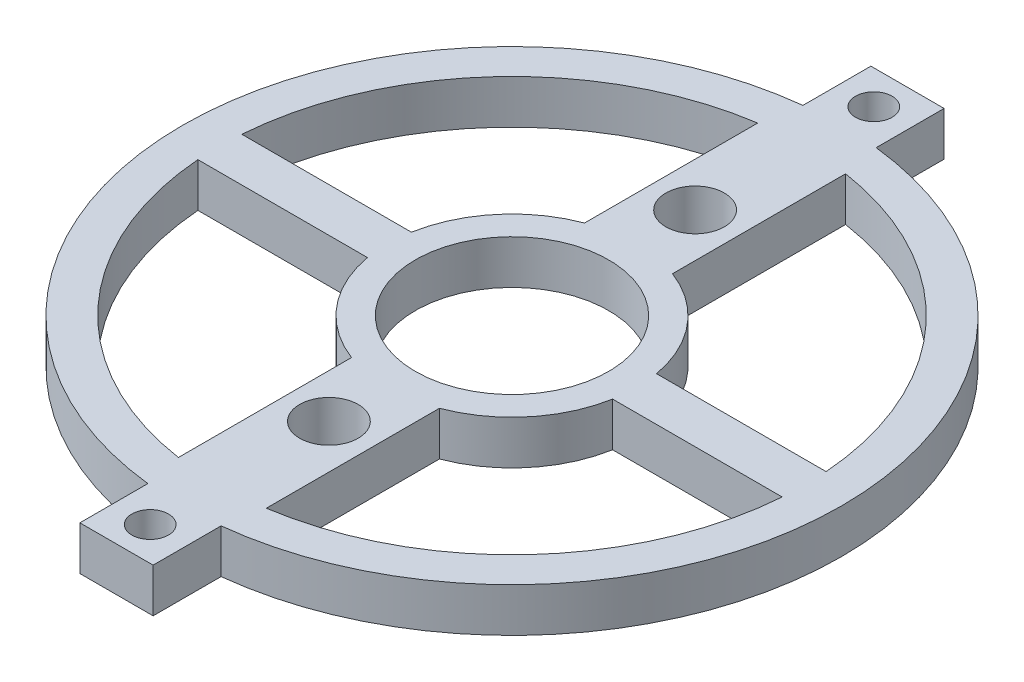
ISO-10303-21;
HEADER;
FILE_DESCRIPTION(('STEP AP214'),'2;1');
FILE_NAME('part.step','',(''),(''),'','','');
FILE_SCHEMA(('AUTOMOTIVE_DESIGN { 1 0 10303 214 1 1 1 1 }'));
ENDSEC;
DATA;
#1=APPLICATION_CONTEXT('core data for automotive mechanical design processes');
#2=APPLICATION_PROTOCOL_DEFINITION('international standard','automotive_design',2000,#1);
#3=PRODUCT_CONTEXT('',#1,'mechanical');
#4=PRODUCT('Part','Part','',(#3));
#5=PRODUCT_RELATED_PRODUCT_CATEGORY('part','',(#4));
#6=PRODUCT_DEFINITION_FORMATION('','',#4);
#7=PRODUCT_DEFINITION_CONTEXT('part definition',#1,'design');
#8=PRODUCT_DEFINITION('design','',#6,#7);
#9=PRODUCT_DEFINITION_SHAPE('','',#8);
#10=(LENGTH_UNIT() NAMED_UNIT(*) SI_UNIT(.MILLI.,.METRE.));
#11=(NAMED_UNIT(*) PLANE_ANGLE_UNIT() SI_UNIT($,.RADIAN.));
#12=(NAMED_UNIT(*) SI_UNIT($,.STERADIAN.) SOLID_ANGLE_UNIT());
#13=UNCERTAINTY_MEASURE_WITH_UNIT(LENGTH_MEASURE(1.E-05),#10,'distance_accuracy_value','');
#14=(GEOMETRIC_REPRESENTATION_CONTEXT(3) GLOBAL_UNCERTAINTY_ASSIGNED_CONTEXT((#13)) GLOBAL_UNIT_ASSIGNED_CONTEXT((#10,
#11,#12)) REPRESENTATION_CONTEXT('',''));
#15=CARTESIAN_POINT('',(0.,0.,0.));
#16=DIRECTION('',(0.,0.,1.));
#17=DIRECTION('',(1.,0.,0.));
#18=AXIS2_PLACEMENT_3D('',#15,#16,#17);
#19=CARTESIAN_POINT('',(0.,3.,0.));
#20=DIRECTION('',(0.,-1.,0.));
#21=DIRECTION('',(0.,0.,-1.));
#22=AXIS2_PLACEMENT_3D('',#19,#20,#21);
#23=CYLINDRICAL_SURFACE('',#22,20.);
#24=CARTESIAN_POINT('',(0.,0.,0.));
#25=DIRECTION('',(0.,1.,0.));
#26=DIRECTION('',(0.,0.,1.));
#27=AXIS2_PLACEMENT_3D('',#24,#25,#26);
#28=CIRCLE('',#27,20.);
#29=CARTESIAN_POINT('',(-3.,0.,-19.7737199332852));
#30=VERTEX_POINT('',#29);
#31=CARTESIAN_POINT('',(-19.9436706751791,0.,-1.5));
#32=VERTEX_POINT('',#31);
#33=EDGE_CURVE('E218',#30,#32,#28,.T.);
#34=ORIENTED_EDGE('',*,*,#33,.F.);
#35=DIRECTION('',(0.,-1.,0.));
#36=VECTOR('',#35,1.);
#37=CARTESIAN_POINT('',(-3.,3.,-19.7737199332852));
#38=LINE('',#37,#36);
#39=CARTESIAN_POINT('',(-3.,3.,-19.7737199332852));
#40=VERTEX_POINT('',#39);
#41=EDGE_CURVE('E204',#40,#30,#38,.T.);
#42=ORIENTED_EDGE('',*,*,#41,.F.);
#43=CARTESIAN_POINT('',(0.,3.,0.));
#44=DIRECTION('',(0.,1.,0.));
#45=DIRECTION('',(0.,0.,1.));
#46=AXIS2_PLACEMENT_3D('',#43,#44,#45);
#47=CIRCLE('',#46,20.);
#48=CARTESIAN_POINT('',(-19.9436706751791,3.,-1.5));
#49=VERTEX_POINT('',#48);
#50=EDGE_CURVE('E216',#40,#49,#47,.T.);
#51=ORIENTED_EDGE('',*,*,#50,.T.);
#52=DIRECTION('',(0.,-1.,0.));
#53=VECTOR('',#52,1.);
#54=CARTESIAN_POINT('',(-19.9436706751791,3.,-1.5));
#55=LINE('',#54,#53);
#56=EDGE_CURVE('E323',#49,#32,#55,.T.);
#57=ORIENTED_EDGE('',*,*,#56,.T.);
#58=EDGE_LOOP('',(#34,#42,#51,#57));
#59=FACE_BOUND('',#58,.T.);
#60=ADVANCED_FACE('F37',(#59),#23,.F.);
#61=CARTESIAN_POINT('',(-19.9436706751791,0.,1.49999999999999));
#62=VERTEX_POINT('',#61);
#63=CARTESIAN_POINT('',(-3.,0.,19.7737199332852));
#64=VERTEX_POINT('',#63);
#65=EDGE_CURVE('E241',#62,#64,#28,.T.);
#66=ORIENTED_EDGE('',*,*,#65,.F.);
#67=DIRECTION('',(0.,-1.,0.));
#68=VECTOR('',#67,1.);
#69=CARTESIAN_POINT('',(-19.9436706751791,3.,1.49999999999999));
#70=LINE('',#69,#68);
#71=CARTESIAN_POINT('',(-19.9436706751791,3.,1.5));
#72=VERTEX_POINT('',#71);
#73=EDGE_CURVE('E325',#72,#62,#70,.T.);
#74=ORIENTED_EDGE('',*,*,#73,.F.);
#75=CARTESIAN_POINT('',(-3.,3.,19.7737199332852));
#76=VERTEX_POINT('',#75);
#77=EDGE_CURVE('E227',#72,#76,#47,.T.);
#78=ORIENTED_EDGE('',*,*,#77,.T.);
#79=DIRECTION('',(0.,-1.,0.));
#80=VECTOR('',#79,1.);
#81=CARTESIAN_POINT('',(-3.,3.,19.7737199332852));
#82=LINE('',#81,#80);
#83=EDGE_CURVE('E333',#76,#64,#82,.T.);
#84=ORIENTED_EDGE('',*,*,#83,.T.);
#85=EDGE_LOOP('',(#66,#74,#78,#84));
#86=FACE_BOUND('',#85,.T.);
#87=ADVANCED_FACE('F462',(#86),#23,.F.);
#88=CARTESIAN_POINT('',(3.00000000000001,0.,19.7737199332852));
#89=VERTEX_POINT('',#88);
#90=CARTESIAN_POINT('',(19.9436706751791,0.,1.5));
#91=VERTEX_POINT('',#90);
#92=EDGE_CURVE('E232',#89,#91,#28,.T.);
#93=ORIENTED_EDGE('',*,*,#92,.F.);
#94=DIRECTION('',(0.,-1.,0.));
#95=VECTOR('',#94,1.);
#96=CARTESIAN_POINT('',(3.00000000000001,3.,19.7737199332852));
#97=LINE('',#96,#95);
#98=CARTESIAN_POINT('',(3.,3.,19.7737199332852));
#99=VERTEX_POINT('',#98);
#100=EDGE_CURVE('E336',#99,#89,#97,.T.);
#101=ORIENTED_EDGE('',*,*,#100,.F.);
#102=CARTESIAN_POINT('',(19.9436706751791,3.,1.5));
#103=VERTEX_POINT('',#102);
#104=EDGE_CURVE('E230',#99,#103,#47,.T.);
#105=ORIENTED_EDGE('',*,*,#104,.T.);
#106=DIRECTION('',(0.,-1.,0.));
#107=VECTOR('',#106,1.);
#108=CARTESIAN_POINT('',(19.9436706751791,3.,1.5));
#109=LINE('',#108,#107);
#110=EDGE_CURVE('E344',#103,#91,#109,.T.);
#111=ORIENTED_EDGE('',*,*,#110,.T.);
#112=EDGE_LOOP('',(#93,#101,#105,#111));
#113=FACE_BOUND('',#112,.T.);
#114=ADVANCED_FACE('F467',(#113),#23,.F.);
#115=CARTESIAN_POINT('',(19.9436706751791,0.,-1.5));
#116=VERTEX_POINT('',#115);
#117=CARTESIAN_POINT('',(3.,0.,-19.7737199332852));
#118=VERTEX_POINT('',#117);
#119=EDGE_CURVE('E240',#116,#118,#28,.T.);
#120=ORIENTED_EDGE('',*,*,#119,.F.);
#121=DIRECTION('',(0.,-1.,0.));
#122=VECTOR('',#121,1.);
#123=CARTESIAN_POINT('',(19.9436706751791,3.,-1.5));
#124=LINE('',#123,#122);
#125=CARTESIAN_POINT('',(19.9436706751791,3.,-1.5));
#126=VERTEX_POINT('',#125);
#127=EDGE_CURVE('E347',#126,#116,#124,.T.);
#128=ORIENTED_EDGE('',*,*,#127,.F.);
#129=CARTESIAN_POINT('',(3.,3.,-19.7737199332852));
#130=VERTEX_POINT('',#129);
#131=EDGE_CURVE('E226',#126,#130,#47,.T.);
#132=ORIENTED_EDGE('',*,*,#131,.T.);
#133=DIRECTION('',(0.,-1.,0.));
#134=VECTOR('',#133,1.);
#135=CARTESIAN_POINT('',(3.,3.,-19.7737199332852));
#136=LINE('',#135,#134);
#137=EDGE_CURVE('E354',#130,#118,#136,.T.);
#138=ORIENTED_EDGE('',*,*,#137,.T.);
#139=EDGE_LOOP('',(#120,#128,#132,#138));
#140=FACE_BOUND('',#139,.T.);
#141=ADVANCED_FACE('F439',(#140),#23,.F.);
#142=CARTESIAN_POINT('',(0.,3.,0.));
#143=DIRECTION('',(0.,-1.,0.));
#144=DIRECTION('',(0.,0.,-1.));
#145=AXIS2_PLACEMENT_3D('',#142,#143,#144);
#146=CYLINDRICAL_SURFACE('',#145,22.5);
#147=DIRECTION('',(0.,-1.,0.));
#148=VECTOR('',#147,1.);
#149=CARTESIAN_POINT('',(2.5,3.,22.3606797749979));
#150=LINE('',#149,#148);
#151=CARTESIAN_POINT('',(2.5,3.,22.3606797749979));
#152=VERTEX_POINT('',#151);
#153=CARTESIAN_POINT('',(2.5,0.,22.3606797749979));
#154=VERTEX_POINT('',#153);
#155=EDGE_CURVE('E286',#152,#154,#150,.T.);
#156=ORIENTED_EDGE('',*,*,#155,.T.);
#157=CARTESIAN_POINT('',(0.,0.,0.));
#158=DIRECTION('',(0.,1.,0.));
#159=DIRECTION('',(0.,0.,1.));
#160=AXIS2_PLACEMENT_3D('',#157,#158,#159);
#161=CIRCLE('',#160,22.5);
#162=CARTESIAN_POINT('',(2.5,0.,-22.3606797749979));
#163=VERTEX_POINT('',#162);
#164=EDGE_CURVE('E236',#154,#163,#161,.T.);
#165=ORIENTED_EDGE('',*,*,#164,.T.);
#166=DIRECTION('',(0.,-1.,0.));
#167=VECTOR('',#166,1.);
#168=CARTESIAN_POINT('',(2.5,3.,-22.3606797749979));
#169=LINE('',#168,#167);
#170=CARTESIAN_POINT('',(2.5,3.,-22.3606797749979));
#171=VERTEX_POINT('',#170);
#172=EDGE_CURVE('E252',#171,#163,#169,.T.);
#173=ORIENTED_EDGE('',*,*,#172,.F.);
#174=CARTESIAN_POINT('',(0.,3.,0.));
#175=DIRECTION('',(0.,1.,0.));
#176=DIRECTION('',(0.,0.,1.));
#177=AXIS2_PLACEMENT_3D('',#174,#175,#176);
#178=CIRCLE('',#177,22.5);
#179=EDGE_CURVE('E46',#152,#171,#178,.T.);
#180=ORIENTED_EDGE('',*,*,#179,.F.);
#181=EDGE_LOOP('',(#156,#165,#173,#180));
#182=FACE_BOUND('',#181,.T.);
#183=ADVANCED_FACE('F39',(#182),#146,.T.);
#184=DIRECTION('',(0.,-1.,0.));
#185=VECTOR('',#184,1.);
#186=CARTESIAN_POINT('',(-2.5,3.,22.3606797749979));
#187=LINE('',#186,#185);
#188=CARTESIAN_POINT('',(-2.5,3.,22.3606797749979));
#189=VERTEX_POINT('',#188);
#190=CARTESIAN_POINT('',(-2.5,0.,22.3606797749979));
#191=VERTEX_POINT('',#190);
#192=EDGE_CURVE('E291',#189,#191,#187,.T.);
#193=ORIENTED_EDGE('',*,*,#192,.F.);
#194=CARTESIAN_POINT('',(-2.5,3.,-22.3606797749979));
#195=VERTEX_POINT('',#194);
#196=EDGE_CURVE('E11',#195,#189,#178,.T.);
#197=ORIENTED_EDGE('',*,*,#196,.F.);
#198=DIRECTION('',(0.,-1.,0.));
#199=VECTOR('',#198,1.);
#200=CARTESIAN_POINT('',(-2.5,3.,-22.3606797749979));
#201=LINE('',#200,#199);
#202=CARTESIAN_POINT('',(-2.5,0.,-22.3606797749979));
#203=VERTEX_POINT('',#202);
#204=EDGE_CURVE('E237',#195,#203,#201,.T.);
#205=ORIENTED_EDGE('',*,*,#204,.T.);
#206=EDGE_CURVE('E41',#203,#191,#161,.T.);
#207=ORIENTED_EDGE('',*,*,#206,.T.);
#208=EDGE_LOOP('',(#193,#197,#205,#207));
#209=FACE_BOUND('',#208,.T.);
#210=ADVANCED_FACE('F429',(#209),#146,.T.);
#211=CARTESIAN_POINT('',(0.,3.,0.));
#212=DIRECTION('',(0.,1.,0.));
#213=DIRECTION('',(0.,0.,1.));
#214=AXIS2_PLACEMENT_3D('',#211,#212,#213);
#215=PLANE('',#214);
#216=CARTESIAN_POINT('',(0.,3.,-12.5));
#217=DIRECTION('',(0.,1.,0.));
#218=DIRECTION('',(0.,0.,1.));
#219=AXIS2_PLACEMENT_3D('',#216,#217,#218);
#220=CIRCLE('',#219,2.);
#221=CARTESIAN_POINT('',(0.,3.,-10.5));
#222=VERTEX_POINT('',#221);
#223=EDGE_CURVE('E411',#222,#222,#220,.T.);
#224=ORIENTED_EDGE('',*,*,#223,.F.);
#225=EDGE_LOOP('',(#224));
#226=FACE_BOUND('',#225,.T.);
#227=CARTESIAN_POINT('',(0.,3.,12.5));
#228=DIRECTION('',(0.,1.,0.));
#229=DIRECTION('',(0.,0.,1.));
#230=AXIS2_PLACEMENT_3D('',#227,#228,#229);
#231=CIRCLE('',#230,2.);
#232=CARTESIAN_POINT('',(0.,3.,14.5));
#233=VERTEX_POINT('',#232);
#234=EDGE_CURVE('E405',#233,#233,#231,.T.);
#235=ORIENTED_EDGE('',*,*,#234,.F.);
#236=EDGE_LOOP('',(#235));
#237=FACE_BOUND('',#236,.T.);
#238=ORIENTED_EDGE('',*,*,#131,.F.);
#239=DIRECTION('',(-1.,0.,0.));
#240=VECTOR('',#239,1.);
#241=CARTESIAN_POINT('',(19.9436706751791,3.,-1.5));
#242=LINE('',#241,#240);
#243=CARTESIAN_POINT('',(8.36660026534076,3.,-1.5));
#244=VERTEX_POINT('',#243);
#245=EDGE_CURVE('E384',#126,#244,#242,.T.);
#246=ORIENTED_EDGE('',*,*,#245,.T.);
#247=CARTESIAN_POINT('',(0.,3.,0.));
#248=DIRECTION('',(0.,1.,0.));
#249=DIRECTION('',(0.,0.,1.));
#250=AXIS2_PLACEMENT_3D('',#247,#248,#249);
#251=CIRCLE('',#250,8.5);
#252=CARTESIAN_POINT('',(3.,3.,-7.95298686029343));
#253=VERTEX_POINT('',#252);
#254=EDGE_CURVE('E382',#244,#253,#251,.T.);
#255=ORIENTED_EDGE('',*,*,#254,.T.);
#256=DIRECTION('',(0.,0.,-1.));
#257=VECTOR('',#256,1.);
#258=CARTESIAN_POINT('',(3.,3.,-19.7737199332852));
#259=LINE('',#258,#257);
#260=EDGE_CURVE('E356',#253,#130,#259,.T.);
#261=ORIENTED_EDGE('',*,*,#260,.T.);
#262=EDGE_LOOP('',(#238,#246,#255,#261));
#263=FACE_BOUND('',#262,.T.);
#264=ORIENTED_EDGE('',*,*,#50,.F.);
#265=DIRECTION('',(0.,0.,1.));
#266=VECTOR('',#265,1.);
#267=CARTESIAN_POINT('',(-3.,3.,-19.7737199332852));
#268=LINE('',#267,#266);
#269=CARTESIAN_POINT('',(-3.,3.,-7.95298686029343));
#270=VERTEX_POINT('',#269);
#271=EDGE_CURVE('E201',#40,#270,#268,.T.);
#272=ORIENTED_EDGE('',*,*,#271,.T.);
#273=CARTESIAN_POINT('',(0.,3.,0.));
#274=DIRECTION('',(0.,1.,0.));
#275=DIRECTION('',(0.,0.,1.));
#276=AXIS2_PLACEMENT_3D('',#273,#274,#275);
#277=CIRCLE('',#276,8.5);
#278=CARTESIAN_POINT('',(-8.36660026534075,3.,-1.50000000000001));
#279=VERTEX_POINT('',#278);
#280=EDGE_CURVE('E211',#270,#279,#277,.T.);
#281=ORIENTED_EDGE('',*,*,#280,.T.);
#282=DIRECTION('',(-1.,0.,0.));
#283=VECTOR('',#282,1.);
#284=CARTESIAN_POINT('',(-19.9436706751791,3.,-1.5));
#285=LINE('',#284,#283);
#286=EDGE_CURVE('E224',#279,#49,#285,.T.);
#287=ORIENTED_EDGE('',*,*,#286,.T.);
#288=EDGE_LOOP('',(#264,#272,#281,#287));
#289=FACE_BOUND('',#288,.T.);
#290=ORIENTED_EDGE('',*,*,#77,.F.);
#291=DIRECTION('',(1.,0.,0.));
#292=VECTOR('',#291,1.);
#293=CARTESIAN_POINT('',(-19.9436706751791,3.,1.5));
#294=LINE('',#293,#292);
#295=CARTESIAN_POINT('',(-8.36660026534076,3.,1.5));
#296=VERTEX_POINT('',#295);
#297=EDGE_CURVE('E61',#72,#296,#294,.T.);
#298=ORIENTED_EDGE('',*,*,#297,.T.);
#299=CARTESIAN_POINT('',(0.,3.,0.));
#300=DIRECTION('',(0.,1.,0.));
#301=DIRECTION('',(0.,0.,1.));
#302=AXIS2_PLACEMENT_3D('',#299,#300,#301);
#303=CIRCLE('',#302,8.5);
#304=CARTESIAN_POINT('',(-3.,3.,7.95298686029343));
#305=VERTEX_POINT('',#304);
#306=EDGE_CURVE('E394',#296,#305,#303,.T.);
#307=ORIENTED_EDGE('',*,*,#306,.T.);
#308=DIRECTION('',(0.,0.,1.));
#309=VECTOR('',#308,1.);
#310=CARTESIAN_POINT('',(-3.,3.,7.95298686029343));
#311=LINE('',#310,#309);
#312=EDGE_CURVE('E392',#305,#76,#311,.T.);
#313=ORIENTED_EDGE('',*,*,#312,.T.);
#314=EDGE_LOOP('',(#290,#298,#307,#313));
#315=FACE_BOUND('',#314,.T.);
#316=ORIENTED_EDGE('',*,*,#196,.T.);
#317=DIRECTION('',(0.,0.,1.));
#318=VECTOR('',#317,1.);
#319=CARTESIAN_POINT('',(-2.5,3.,27.));
#320=LINE('',#319,#318);
#321=CARTESIAN_POINT('',(-2.5,3.,27.));
#322=VERTEX_POINT('',#321);
#323=EDGE_CURVE('E311',#189,#322,#320,.T.);
#324=ORIENTED_EDGE('',*,*,#323,.T.);
#325=DIRECTION('',(1.,0.,0.));
#326=VECTOR('',#325,1.);
#327=CARTESIAN_POINT('',(2.5,3.,27.));
#328=LINE('',#327,#326);
#329=CARTESIAN_POINT('',(2.5,3.,27.));
#330=VERTEX_POINT('',#329);
#331=EDGE_CURVE('E300',#322,#330,#328,.T.);
#332=ORIENTED_EDGE('',*,*,#331,.T.);
#333=DIRECTION('',(0.,0.,-1.));
#334=VECTOR('',#333,1.);
#335=CARTESIAN_POINT('',(2.5,3.,27.));
#336=LINE('',#335,#334);
#337=EDGE_CURVE('E303',#330,#152,#336,.T.);
#338=ORIENTED_EDGE('',*,*,#337,.T.);
#339=ORIENTED_EDGE('',*,*,#179,.T.);
#340=DIRECTION('',(0.,0.,-1.));
#341=VECTOR('',#340,1.);
#342=CARTESIAN_POINT('',(2.5,3.,-27.));
#343=LINE('',#342,#341);
#344=CARTESIAN_POINT('',(2.5,3.,-27.));
#345=VERTEX_POINT('',#344);
#346=EDGE_CURVE('E279',#171,#345,#343,.T.);
#347=ORIENTED_EDGE('',*,*,#346,.T.);
#348=DIRECTION('',(-1.,0.,0.));
#349=VECTOR('',#348,1.);
#350=CARTESIAN_POINT('',(-2.5,3.,-27.));
#351=LINE('',#350,#349);
#352=CARTESIAN_POINT('',(-2.5,3.,-27.));
#353=VERTEX_POINT('',#352);
#354=EDGE_CURVE('E268',#345,#353,#351,.T.);
#355=ORIENTED_EDGE('',*,*,#354,.T.);
#356=DIRECTION('',(0.,0.,1.));
#357=VECTOR('',#356,1.);
#358=CARTESIAN_POINT('',(-2.5,3.,-27.));
#359=LINE('',#358,#357);
#360=EDGE_CURVE('E271',#353,#195,#359,.T.);
#361=ORIENTED_EDGE('',*,*,#360,.T.);
#362=EDGE_LOOP('',(#316,#324,#332,#338,#339,#347,#355,#361));
#363=FACE_BOUND('',#362,.T.);
#364=ORIENTED_EDGE('',*,*,#104,.F.);
#365=DIRECTION('',(0.,0.,-1.));
#366=VECTOR('',#365,1.);
#367=CARTESIAN_POINT('',(3.,3.,7.95298686029343));
#368=LINE('',#367,#366);
#369=CARTESIAN_POINT('',(3.,3.,7.95298686029343));
#370=VERTEX_POINT('',#369);
#371=EDGE_CURVE('E390',#99,#370,#368,.T.);
#372=ORIENTED_EDGE('',*,*,#371,.T.);
#373=CARTESIAN_POINT('',(0.,3.,0.));
#374=DIRECTION('',(0.,1.,0.));
#375=DIRECTION('',(0.,0.,1.));
#376=AXIS2_PLACEMENT_3D('',#373,#374,#375);
#377=CIRCLE('',#376,8.5);
#378=CARTESIAN_POINT('',(8.36660026534076,3.,1.5));
#379=VERTEX_POINT('',#378);
#380=EDGE_CURVE('E388',#370,#379,#377,.T.);
#381=ORIENTED_EDGE('',*,*,#380,.T.);
#382=DIRECTION('',(1.,0.,0.));
#383=VECTOR('',#382,1.);
#384=CARTESIAN_POINT('',(19.9436706751791,3.,1.5));
#385=LINE('',#384,#383);
#386=EDGE_CURVE('E386',#379,#103,#385,.T.);
#387=ORIENTED_EDGE('',*,*,#386,.T.);
#388=EDGE_LOOP('',(#364,#372,#381,#387));
#389=FACE_BOUND('',#388,.T.);
#390=CARTESIAN_POINT('',(0.,3.,-24.7));
#391=DIRECTION('',(0.,1.,0.));
#392=DIRECTION('',(0.,0.,1.));
#393=AXIS2_PLACEMENT_3D('',#390,#391,#392);
#394=CIRCLE('',#393,1.25);
#395=CARTESIAN_POINT('',(0.,3.,-23.45));
#396=VERTEX_POINT('',#395);
#397=EDGE_CURVE('E277',#396,#396,#394,.T.);
#398=ORIENTED_EDGE('',*,*,#397,.F.);
#399=EDGE_LOOP('',(#398));
#400=FACE_BOUND('',#399,.T.);
#401=CARTESIAN_POINT('',(0.,3.,24.7));
#402=DIRECTION('',(0.,1.,0.));
#403=DIRECTION('',(0.,0.,-1.));
#404=AXIS2_PLACEMENT_3D('',#401,#402,#403);
#405=CIRCLE('',#404,1.25);
#406=CARTESIAN_POINT('',(0.,3.,23.45));
#407=VERTEX_POINT('',#406);
#408=EDGE_CURVE('E309',#407,#407,#405,.T.);
#409=ORIENTED_EDGE('',*,*,#408,.F.);
#410=EDGE_LOOP('',(#409));
#411=FACE_BOUND('',#410,.T.);
#412=CARTESIAN_POINT('',(0.,3.,0.));
#413=DIRECTION('',(0.,1.,0.));
#414=DIRECTION('',(0.,0.,1.));
#415=AXIS2_PLACEMENT_3D('',#412,#413,#414);
#416=CIRCLE('',#415,6.6);
#417=CARTESIAN_POINT('',(0.,3.,6.6));
#418=VERTEX_POINT('',#417);
#419=EDGE_CURVE('E380',#418,#418,#416,.T.);
#420=ORIENTED_EDGE('',*,*,#419,.F.);
#421=EDGE_LOOP('',(#420));
#422=FACE_BOUND('',#421,.T.);
#423=ADVANCED_FACE('F221',(#226,#237,#263,#289,#315,#363,#389,#400,#411,#422),#215,.T.);
#424=CARTESIAN_POINT('',(0.,0.,0.));
#425=DIRECTION('',(0.,1.,0.));
#426=DIRECTION('',(0.,0.,1.));
#427=AXIS2_PLACEMENT_3D('',#424,#425,#426);
#428=PLANE('',#427);
#429=CARTESIAN_POINT('',(0.,0.,-12.5));
#430=DIRECTION('',(0.,1.,0.));
#431=DIRECTION('',(0.,0.,1.));
#432=AXIS2_PLACEMENT_3D('',#429,#430,#431);
#433=CIRCLE('',#432,2.);
#434=CARTESIAN_POINT('',(0.,0.,-10.5));
#435=VERTEX_POINT('',#434);
#436=EDGE_CURVE('E402',#435,#435,#433,.T.);
#437=ORIENTED_EDGE('',*,*,#436,.T.);
#438=EDGE_LOOP('',(#437));
#439=FACE_BOUND('',#438,.T.);
#440=CARTESIAN_POINT('',(0.,0.,12.5));
#441=DIRECTION('',(0.,1.,0.));
#442=DIRECTION('',(0.,0.,1.));
#443=AXIS2_PLACEMENT_3D('',#440,#441,#442);
#444=CIRCLE('',#443,2.);
#445=CARTESIAN_POINT('',(0.,0.,14.5));
#446=VERTEX_POINT('',#445);
#447=EDGE_CURVE('E408',#446,#446,#444,.T.);
#448=ORIENTED_EDGE('',*,*,#447,.T.);
#449=EDGE_LOOP('',(#448));
#450=FACE_BOUND('',#449,.T.);
#451=DIRECTION('',(-1.,0.,0.));
#452=VECTOR('',#451,1.);
#453=CARTESIAN_POINT('',(19.9436706751791,0.,-1.5));
#454=LINE('',#453,#452);
#455=CARTESIAN_POINT('',(8.36660026534076,0.,-1.5));
#456=VERTEX_POINT('',#455);
#457=EDGE_CURVE('E360',#116,#456,#454,.T.);
#458=ORIENTED_EDGE('',*,*,#457,.F.);
#459=ORIENTED_EDGE('',*,*,#119,.T.);
#460=DIRECTION('',(0.,0.,-1.));
#461=VECTOR('',#460,1.);
#462=CARTESIAN_POINT('',(3.,0.,-19.7737199332852));
#463=LINE('',#462,#461);
#464=CARTESIAN_POINT('',(3.,0.,-7.95298686029343));
#465=VERTEX_POINT('',#464);
#466=EDGE_CURVE('E53',#465,#118,#463,.T.);
#467=ORIENTED_EDGE('',*,*,#466,.F.);
#468=CARTESIAN_POINT('',(0.,0.,0.));
#469=DIRECTION('',(0.,1.,0.));
#470=DIRECTION('',(0.,0.,1.));
#471=AXIS2_PLACEMENT_3D('',#468,#469,#470);
#472=CIRCLE('',#471,8.5);
#473=EDGE_CURVE('E358',#456,#465,#472,.T.);
#474=ORIENTED_EDGE('',*,*,#473,.F.);
#475=EDGE_LOOP('',(#458,#459,#467,#474));
#476=FACE_BOUND('',#475,.T.);
#477=DIRECTION('',(0.,0.,1.));
#478=VECTOR('',#477,1.);
#479=CARTESIAN_POINT('',(-3.,0.,-19.7737199332852));
#480=LINE('',#479,#478);
#481=CARTESIAN_POINT('',(-3.,0.,-7.95298686029343));
#482=VERTEX_POINT('',#481);
#483=EDGE_CURVE('E378',#30,#482,#480,.T.);
#484=ORIENTED_EDGE('',*,*,#483,.F.);
#485=ORIENTED_EDGE('',*,*,#33,.T.);
#486=DIRECTION('',(-1.,0.,0.));
#487=VECTOR('',#486,1.);
#488=CARTESIAN_POINT('',(-19.9436706751791,0.,-1.5));
#489=LINE('',#488,#487);
#490=CARTESIAN_POINT('',(-8.36660026534075,0.,-1.50000000000001));
#491=VERTEX_POINT('',#490);
#492=EDGE_CURVE('E374',#491,#32,#489,.T.);
#493=ORIENTED_EDGE('',*,*,#492,.F.);
#494=CARTESIAN_POINT('',(0.,0.,0.));
#495=DIRECTION('',(0.,1.,0.));
#496=DIRECTION('',(0.,0.,1.));
#497=AXIS2_PLACEMENT_3D('',#494,#495,#496);
#498=CIRCLE('',#497,8.5);
#499=EDGE_CURVE('E376',#482,#491,#498,.T.);
#500=ORIENTED_EDGE('',*,*,#499,.F.);
#501=EDGE_LOOP('',(#484,#485,#493,#500));
#502=FACE_BOUND('',#501,.T.);
#503=DIRECTION('',(1.,0.,0.));
#504=VECTOR('',#503,1.);
#505=CARTESIAN_POINT('',(-19.9436706751791,0.,1.5));
#506=LINE('',#505,#504);
#507=CARTESIAN_POINT('',(-8.36660026534076,0.,1.5));
#508=VERTEX_POINT('',#507);
#509=EDGE_CURVE('E372',#62,#508,#506,.T.);
#510=ORIENTED_EDGE('',*,*,#509,.F.);
#511=ORIENTED_EDGE('',*,*,#65,.T.);
#512=DIRECTION('',(0.,0.,1.));
#513=VECTOR('',#512,1.);
#514=CARTESIAN_POINT('',(-3.,0.,7.95298686029343));
#515=LINE('',#514,#513);
#516=CARTESIAN_POINT('',(-3.,0.,7.95298686029343));
#517=VERTEX_POINT('',#516);
#518=EDGE_CURVE('E368',#517,#64,#515,.T.);
#519=ORIENTED_EDGE('',*,*,#518,.F.);
#520=CARTESIAN_POINT('',(0.,0.,0.));
#521=DIRECTION('',(0.,1.,0.));
#522=DIRECTION('',(0.,0.,1.));
#523=AXIS2_PLACEMENT_3D('',#520,#521,#522);
#524=CIRCLE('',#523,8.5);
#525=EDGE_CURVE('E370',#508,#517,#524,.T.);
#526=ORIENTED_EDGE('',*,*,#525,.F.);
#527=EDGE_LOOP('',(#510,#511,#519,#526));
#528=FACE_BOUND('',#527,.T.);
#529=ORIENTED_EDGE('',*,*,#206,.F.);
#530=DIRECTION('',(0.,0.,1.));
#531=VECTOR('',#530,1.);
#532=CARTESIAN_POINT('',(-2.5,0.,-27.));
#533=LINE('',#532,#531);
#534=CARTESIAN_POINT('',(-2.5,0.,-27.));
#535=VERTEX_POINT('',#534);
#536=EDGE_CURVE('E274',#535,#203,#533,.T.);
#537=ORIENTED_EDGE('',*,*,#536,.F.);
#538=DIRECTION('',(-1.,0.,0.));
#539=VECTOR('',#538,1.);
#540=CARTESIAN_POINT('',(-2.5,0.,-27.));
#541=LINE('',#540,#539);
#542=CARTESIAN_POINT('',(2.5,0.,-27.));
#543=VERTEX_POINT('',#542);
#544=EDGE_CURVE('E269',#543,#535,#541,.T.);
#545=ORIENTED_EDGE('',*,*,#544,.F.);
#546=DIRECTION('',(0.,0.,-1.));
#547=VECTOR('',#546,1.);
#548=CARTESIAN_POINT('',(2.5,0.,-27.));
#549=LINE('',#548,#547);
#550=EDGE_CURVE('E272',#163,#543,#549,.T.);
#551=ORIENTED_EDGE('',*,*,#550,.F.);
#552=ORIENTED_EDGE('',*,*,#164,.F.);
#553=DIRECTION('',(0.,0.,-1.));
#554=VECTOR('',#553,1.);
#555=CARTESIAN_POINT('',(2.5,0.,27.));
#556=LINE('',#555,#554);
#557=CARTESIAN_POINT('',(2.5,0.,27.));
#558=VERTEX_POINT('',#557);
#559=EDGE_CURVE('E306',#558,#154,#556,.T.);
#560=ORIENTED_EDGE('',*,*,#559,.F.);
#561=DIRECTION('',(1.,0.,0.));
#562=VECTOR('',#561,1.);
#563=CARTESIAN_POINT('',(2.5,0.,27.));
#564=LINE('',#563,#562);
#565=CARTESIAN_POINT('',(-2.5,0.,27.));
#566=VERTEX_POINT('',#565);
#567=EDGE_CURVE('E301',#566,#558,#564,.T.);
#568=ORIENTED_EDGE('',*,*,#567,.F.);
#569=DIRECTION('',(0.,0.,1.));
#570=VECTOR('',#569,1.);
#571=CARTESIAN_POINT('',(-2.5,0.,27.));
#572=LINE('',#571,#570);
#573=EDGE_CURVE('E304',#191,#566,#572,.T.);
#574=ORIENTED_EDGE('',*,*,#573,.F.);
#575=EDGE_LOOP('',(#529,#537,#545,#551,#552,#560,#568,#574));
#576=FACE_BOUND('',#575,.T.);
#577=ORIENTED_EDGE('',*,*,#92,.T.);
#578=DIRECTION('',(1.,0.,0.));
#579=VECTOR('',#578,1.);
#580=CARTESIAN_POINT('',(19.9436706751791,0.,1.5));
#581=LINE('',#580,#579);
#582=CARTESIAN_POINT('',(8.36660026534076,0.,1.5));
#583=VERTEX_POINT('',#582);
#584=EDGE_CURVE('E362',#583,#91,#581,.T.);
#585=ORIENTED_EDGE('',*,*,#584,.F.);
#586=CARTESIAN_POINT('',(0.,0.,0.));
#587=DIRECTION('',(0.,1.,0.));
#588=DIRECTION('',(0.,0.,1.));
#589=AXIS2_PLACEMENT_3D('',#586,#587,#588);
#590=CIRCLE('',#589,8.5);
#591=CARTESIAN_POINT('',(3.,0.,7.95298686029343));
#592=VERTEX_POINT('',#591);
#593=EDGE_CURVE('E364',#592,#583,#590,.T.);
#594=ORIENTED_EDGE('',*,*,#593,.F.);
#595=DIRECTION('',(0.,0.,-1.));
#596=VECTOR('',#595,1.);
#597=CARTESIAN_POINT('',(3.,0.,7.95298686029343));
#598=LINE('',#597,#596);
#599=EDGE_CURVE('E366',#89,#592,#598,.T.);
#600=ORIENTED_EDGE('',*,*,#599,.F.);
#601=EDGE_LOOP('',(#577,#585,#594,#600));
#602=FACE_BOUND('',#601,.T.);
#603=CARTESIAN_POINT('',(0.,0.,-24.7));
#604=DIRECTION('',(0.,1.,0.));
#605=DIRECTION('',(0.,0.,1.));
#606=AXIS2_PLACEMENT_3D('',#603,#604,#605);
#607=CIRCLE('',#606,1.25);
#608=CARTESIAN_POINT('',(0.,0.,-23.45));
#609=VERTEX_POINT('',#608);
#610=EDGE_CURVE('E283',#609,#609,#607,.T.);
#611=ORIENTED_EDGE('',*,*,#610,.T.);
#612=EDGE_LOOP('',(#611));
#613=FACE_BOUND('',#612,.T.);
#614=CARTESIAN_POINT('',(0.,0.,24.7));
#615=DIRECTION('',(0.,1.,0.));
#616=DIRECTION('',(0.,0.,-1.));
#617=AXIS2_PLACEMENT_3D('',#614,#615,#616);
#618=CIRCLE('',#617,1.25);
#619=CARTESIAN_POINT('',(0.,0.,23.45));
#620=VERTEX_POINT('',#619);
#621=EDGE_CURVE('E219',#620,#620,#618,.T.);
#622=ORIENTED_EDGE('',*,*,#621,.T.);
#623=EDGE_LOOP('',(#622));
#624=FACE_BOUND('',#623,.T.);
#625=CARTESIAN_POINT('',(0.,0.,0.));
#626=DIRECTION('',(0.,1.,0.));
#627=DIRECTION('',(0.,0.,1.));
#628=AXIS2_PLACEMENT_3D('',#625,#626,#627);
#629=CIRCLE('',#628,6.6);
#630=CARTESIAN_POINT('',(0.,0.,6.6));
#631=VERTEX_POINT('',#630);
#632=EDGE_CURVE('E399',#631,#631,#629,.T.);
#633=ORIENTED_EDGE('',*,*,#632,.T.);
#634=EDGE_LOOP('',(#633));
#635=FACE_BOUND('',#634,.T.);
#636=ADVANCED_FACE('F417',(#439,#450,#476,#502,#528,#576,#602,#613,#624,#635),#428,.F.);
#637=CARTESIAN_POINT('',(-2.5,3.,-27.));
#638=DIRECTION('',(1.,0.,0.));
#639=DIRECTION('',(0.,0.,-1.));
#640=AXIS2_PLACEMENT_3D('',#637,#638,#639);
#641=PLANE('',#640);
#642=ORIENTED_EDGE('',*,*,#536,.T.);
#643=ORIENTED_EDGE('',*,*,#204,.F.);
#644=ORIENTED_EDGE('',*,*,#360,.F.);
#645=DIRECTION('',(0.,-1.,0.));
#646=VECTOR('',#645,1.);
#647=CARTESIAN_POINT('',(-2.5,3.,-27.));
#648=LINE('',#647,#646);
#649=EDGE_CURVE('E263',#353,#535,#648,.T.);
#650=ORIENTED_EDGE('',*,*,#649,.T.);
#651=EDGE_LOOP('',(#642,#643,#644,#650));
#652=FACE_BOUND('',#651,.T.);
#653=ADVANCED_FACE('F505',(#652),#641,.F.);
#654=CARTESIAN_POINT('',(2.5,3.,-27.));
#655=DIRECTION('',(-1.,0.,0.));
#656=DIRECTION('',(0.,0.,1.));
#657=AXIS2_PLACEMENT_3D('',#654,#655,#656);
#658=PLANE('',#657);
#659=ORIENTED_EDGE('',*,*,#550,.T.);
#660=DIRECTION('',(0.,-1.,0.));
#661=VECTOR('',#660,1.);
#662=CARTESIAN_POINT('',(2.5,3.,-27.));
#663=LINE('',#662,#661);
#664=EDGE_CURVE('E257',#345,#543,#663,.T.);
#665=ORIENTED_EDGE('',*,*,#664,.F.);
#666=ORIENTED_EDGE('',*,*,#346,.F.);
#667=ORIENTED_EDGE('',*,*,#172,.T.);
#668=EDGE_LOOP('',(#659,#665,#666,#667));
#669=FACE_BOUND('',#668,.T.);
#670=ADVANCED_FACE('F509',(#669),#658,.F.);
#671=CARTESIAN_POINT('',(-2.5,3.,-27.));
#672=DIRECTION('',(0.,0.,1.));
#673=DIRECTION('',(1.,0.,0.));
#674=AXIS2_PLACEMENT_3D('',#671,#672,#673);
#675=PLANE('',#674);
#676=ORIENTED_EDGE('',*,*,#544,.T.);
#677=ORIENTED_EDGE('',*,*,#649,.F.);
#678=ORIENTED_EDGE('',*,*,#354,.F.);
#679=ORIENTED_EDGE('',*,*,#664,.T.);
#680=EDGE_LOOP('',(#676,#677,#678,#679));
#681=FACE_BOUND('',#680,.T.);
#682=ADVANCED_FACE('F514',(#681),#675,.F.);
#683=CARTESIAN_POINT('',(0.,3.,-24.7));
#684=DIRECTION('',(0.,-1.,0.));
#685=DIRECTION('',(0.,0.,-1.));
#686=AXIS2_PLACEMENT_3D('',#683,#684,#685);
#687=CYLINDRICAL_SURFACE('',#686,1.25);
#688=ORIENTED_EDGE('',*,*,#397,.T.);
#689=EDGE_LOOP('',(#688));
#690=FACE_BOUND('',#689,.T.);
#691=ORIENTED_EDGE('',*,*,#610,.F.);
#692=EDGE_LOOP('',(#691));
#693=FACE_BOUND('',#692,.T.);
#694=ADVANCED_FACE('F519',(#690,#693),#687,.F.);
#695=CARTESIAN_POINT('',(2.5,3.,27.));
#696=DIRECTION('',(-1.,0.,0.));
#697=DIRECTION('',(0.,0.,1.));
#698=AXIS2_PLACEMENT_3D('',#695,#696,#697);
#699=PLANE('',#698);
#700=ORIENTED_EDGE('',*,*,#559,.T.);
#701=ORIENTED_EDGE('',*,*,#155,.F.);
#702=ORIENTED_EDGE('',*,*,#337,.F.);
#703=DIRECTION('',(0.,-1.,0.));
#704=VECTOR('',#703,1.);
#705=CARTESIAN_POINT('',(2.5,3.,27.));
#706=LINE('',#705,#704);
#707=EDGE_CURVE('E297',#330,#558,#706,.T.);
#708=ORIENTED_EDGE('',*,*,#707,.T.);
#709=EDGE_LOOP('',(#700,#701,#702,#708));
#710=FACE_BOUND('',#709,.T.);
#711=ADVANCED_FACE('F523',(#710),#699,.F.);
#712=CARTESIAN_POINT('',(-2.5,3.,27.));
#713=DIRECTION('',(1.,0.,0.));
#714=DIRECTION('',(0.,0.,-1.));
#715=AXIS2_PLACEMENT_3D('',#712,#713,#714);
#716=PLANE('',#715);
#717=ORIENTED_EDGE('',*,*,#573,.T.);
#718=DIRECTION('',(0.,-1.,0.));
#719=VECTOR('',#718,1.);
#720=CARTESIAN_POINT('',(-2.5,3.,27.));
#721=LINE('',#720,#719);
#722=EDGE_CURVE('E294',#322,#566,#721,.T.);
#723=ORIENTED_EDGE('',*,*,#722,.F.);
#724=ORIENTED_EDGE('',*,*,#323,.F.);
#725=ORIENTED_EDGE('',*,*,#192,.T.);
#726=EDGE_LOOP('',(#717,#723,#724,#725));
#727=FACE_BOUND('',#726,.T.);
#728=ADVANCED_FACE('F527',(#727),#716,.F.);
#729=CARTESIAN_POINT('',(2.5,3.,27.));
#730=DIRECTION('',(0.,0.,-1.));
#731=DIRECTION('',(-1.,0.,0.));
#732=AXIS2_PLACEMENT_3D('',#729,#730,#731);
#733=PLANE('',#732);
#734=ORIENTED_EDGE('',*,*,#567,.T.);
#735=ORIENTED_EDGE('',*,*,#707,.F.);
#736=ORIENTED_EDGE('',*,*,#331,.F.);
#737=ORIENTED_EDGE('',*,*,#722,.T.);
#738=EDGE_LOOP('',(#734,#735,#736,#737));
#739=FACE_BOUND('',#738,.T.);
#740=ADVANCED_FACE('F531',(#739),#733,.F.);
#741=CARTESIAN_POINT('',(0.,3.,24.7));
#742=DIRECTION('',(0.,-1.,0.));
#743=DIRECTION('',(0.,0.,-1.));
#744=AXIS2_PLACEMENT_3D('',#741,#742,#743);
#745=CYLINDRICAL_SURFACE('',#744,1.25);
#746=ORIENTED_EDGE('',*,*,#408,.T.);
#747=EDGE_LOOP('',(#746));
#748=FACE_BOUND('',#747,.T.);
#749=ORIENTED_EDGE('',*,*,#621,.F.);
#750=EDGE_LOOP('',(#749));
#751=FACE_BOUND('',#750,.T.);
#752=ADVANCED_FACE('F535',(#748,#751),#745,.F.);
#753=CARTESIAN_POINT('',(-3.,3.,-19.7737199332852));
#754=DIRECTION('',(1.,0.,0.));
#755=DIRECTION('',(0.,0.,-1.));
#756=AXIS2_PLACEMENT_3D('',#753,#754,#755);
#757=PLANE('',#756);
#758=ORIENTED_EDGE('',*,*,#483,.T.);
#759=DIRECTION('',(0.,-1.,0.));
#760=VECTOR('',#759,1.);
#761=CARTESIAN_POINT('',(-3.,3.,-7.95298686029343));
#762=LINE('',#761,#760);
#763=EDGE_CURVE('E207',#270,#482,#762,.T.);
#764=ORIENTED_EDGE('',*,*,#763,.F.);
#765=ORIENTED_EDGE('',*,*,#271,.F.);
#766=ORIENTED_EDGE('',*,*,#41,.T.);
#767=EDGE_LOOP('',(#758,#764,#765,#766));
#768=FACE_BOUND('',#767,.T.);
#769=ADVANCED_FACE('F203',(#768),#757,.F.);
#770=CARTESIAN_POINT('',(0.,3.,0.));
#771=DIRECTION('',(0.,-1.,0.));
#772=DIRECTION('',(0.,0.,-1.));
#773=AXIS2_PLACEMENT_3D('',#770,#771,#772);
#774=CYLINDRICAL_SURFACE('',#773,8.5);
#775=ORIENTED_EDGE('',*,*,#499,.T.);
#776=DIRECTION('',(0.,-1.,0.));
#777=VECTOR('',#776,1.);
#778=CARTESIAN_POINT('',(-8.36660026534075,3.,-1.50000000000001));
#779=LINE('',#778,#777);
#780=EDGE_CURVE('E320',#279,#491,#779,.T.);
#781=ORIENTED_EDGE('',*,*,#780,.F.);
#782=ORIENTED_EDGE('',*,*,#280,.F.);
#783=ORIENTED_EDGE('',*,*,#763,.T.);
#784=EDGE_LOOP('',(#775,#781,#782,#783));
#785=FACE_BOUND('',#784,.T.);
#786=ADVANCED_FACE('F542',(#785),#774,.T.);
#787=CARTESIAN_POINT('',(-19.9436706751791,3.,-1.5));
#788=DIRECTION('',(0.,0.,1.));
#789=DIRECTION('',(1.,0.,0.));
#790=AXIS2_PLACEMENT_3D('',#787,#788,#789);
#791=PLANE('',#790);
#792=ORIENTED_EDGE('',*,*,#492,.T.);
#793=ORIENTED_EDGE('',*,*,#56,.F.);
#794=ORIENTED_EDGE('',*,*,#286,.F.);
#795=ORIENTED_EDGE('',*,*,#780,.T.);
#796=EDGE_LOOP('',(#792,#793,#794,#795));
#797=FACE_BOUND('',#796,.T.);
#798=ADVANCED_FACE('F545',(#797),#791,.F.);
#799=CARTESIAN_POINT('',(-19.9436706751791,3.,1.5));
#800=DIRECTION('',(0.,0.,-1.));
#801=DIRECTION('',(-1.,0.,0.));
#802=AXIS2_PLACEMENT_3D('',#799,#800,#801);
#803=PLANE('',#802);
#804=ORIENTED_EDGE('',*,*,#509,.T.);
#805=DIRECTION('',(0.,-1.,0.));
#806=VECTOR('',#805,1.);
#807=CARTESIAN_POINT('',(-8.36660026534076,3.,1.5));
#808=LINE('',#807,#806);
#809=EDGE_CURVE('E327',#296,#508,#808,.T.);
#810=ORIENTED_EDGE('',*,*,#809,.F.);
#811=ORIENTED_EDGE('',*,*,#297,.F.);
#812=ORIENTED_EDGE('',*,*,#73,.T.);
#813=EDGE_LOOP('',(#804,#810,#811,#812));
#814=FACE_BOUND('',#813,.T.);
#815=ADVANCED_FACE('F549',(#814),#803,.F.);
#816=CARTESIAN_POINT('',(0.,3.,0.));
#817=DIRECTION('',(0.,-1.,0.));
#818=DIRECTION('',(0.,0.,-1.));
#819=AXIS2_PLACEMENT_3D('',#816,#817,#818);
#820=CYLINDRICAL_SURFACE('',#819,8.5);
#821=ORIENTED_EDGE('',*,*,#525,.T.);
#822=DIRECTION('',(0.,-1.,0.));
#823=VECTOR('',#822,1.);
#824=CARTESIAN_POINT('',(-3.,3.,7.95298686029343));
#825=LINE('',#824,#823);
#826=EDGE_CURVE('E330',#305,#517,#825,.T.);
#827=ORIENTED_EDGE('',*,*,#826,.F.);
#828=ORIENTED_EDGE('',*,*,#306,.F.);
#829=ORIENTED_EDGE('',*,*,#809,.T.);
#830=EDGE_LOOP('',(#821,#827,#828,#829));
#831=FACE_BOUND('',#830,.T.);
#832=ADVANCED_FACE('F553',(#831),#820,.T.);
#833=CARTESIAN_POINT('',(-3.,3.,7.95298686029343));
#834=DIRECTION('',(1.,0.,0.));
#835=DIRECTION('',(0.,0.,-1.));
#836=AXIS2_PLACEMENT_3D('',#833,#834,#835);
#837=PLANE('',#836);
#838=ORIENTED_EDGE('',*,*,#518,.T.);
#839=ORIENTED_EDGE('',*,*,#83,.F.);
#840=ORIENTED_EDGE('',*,*,#312,.F.);
#841=ORIENTED_EDGE('',*,*,#826,.T.);
#842=EDGE_LOOP('',(#838,#839,#840,#841));
#843=FACE_BOUND('',#842,.T.);
#844=ADVANCED_FACE('F556',(#843),#837,.F.);
#845=CARTESIAN_POINT('',(3.,3.,7.95298686029343));
#846=DIRECTION('',(-1.,0.,0.));
#847=DIRECTION('',(0.,0.,1.));
#848=AXIS2_PLACEMENT_3D('',#845,#846,#847);
#849=PLANE('',#848);
#850=ORIENTED_EDGE('',*,*,#599,.T.);
#851=DIRECTION('',(0.,-1.,0.));
#852=VECTOR('',#851,1.);
#853=CARTESIAN_POINT('',(3.,3.,7.95298686029343));
#854=LINE('',#853,#852);
#855=EDGE_CURVE('E338',#370,#592,#854,.T.);
#856=ORIENTED_EDGE('',*,*,#855,.F.);
#857=ORIENTED_EDGE('',*,*,#371,.F.);
#858=ORIENTED_EDGE('',*,*,#100,.T.);
#859=EDGE_LOOP('',(#850,#856,#857,#858));
#860=FACE_BOUND('',#859,.T.);
#861=ADVANCED_FACE('F493',(#860),#849,.F.);
#862=CARTESIAN_POINT('',(0.,3.,0.));
#863=DIRECTION('',(0.,-1.,0.));
#864=DIRECTION('',(0.,0.,-1.));
#865=AXIS2_PLACEMENT_3D('',#862,#863,#864);
#866=CYLINDRICAL_SURFACE('',#865,8.5);
#867=ORIENTED_EDGE('',*,*,#593,.T.);
#868=DIRECTION('',(0.,-1.,0.));
#869=VECTOR('',#868,1.);
#870=CARTESIAN_POINT('',(8.36660026534076,3.,1.5));
#871=LINE('',#870,#869);
#872=EDGE_CURVE('E341',#379,#583,#871,.T.);
#873=ORIENTED_EDGE('',*,*,#872,.F.);
#874=ORIENTED_EDGE('',*,*,#380,.F.);
#875=ORIENTED_EDGE('',*,*,#855,.T.);
#876=EDGE_LOOP('',(#867,#873,#874,#875));
#877=FACE_BOUND('',#876,.T.);
#878=ADVANCED_FACE('F489',(#877),#866,.T.);
#879=CARTESIAN_POINT('',(19.9436706751791,3.,1.5));
#880=DIRECTION('',(0.,0.,-1.));
#881=DIRECTION('',(-1.,0.,0.));
#882=AXIS2_PLACEMENT_3D('',#879,#880,#881);
#883=PLANE('',#882);
#884=ORIENTED_EDGE('',*,*,#584,.T.);
#885=ORIENTED_EDGE('',*,*,#110,.F.);
#886=ORIENTED_EDGE('',*,*,#386,.F.);
#887=ORIENTED_EDGE('',*,*,#872,.T.);
#888=EDGE_LOOP('',(#884,#885,#886,#887));
#889=FACE_BOUND('',#888,.T.);
#890=ADVANCED_FACE('F484',(#889),#883,.F.);
#891=CARTESIAN_POINT('',(19.9436706751791,3.,-1.5));
#892=DIRECTION('',(0.,0.,1.));
#893=DIRECTION('',(1.,0.,0.));
#894=AXIS2_PLACEMENT_3D('',#891,#892,#893);
#895=PLANE('',#894);
#896=ORIENTED_EDGE('',*,*,#457,.T.);
#897=DIRECTION('',(0.,-1.,0.));
#898=VECTOR('',#897,1.);
#899=CARTESIAN_POINT('',(8.36660026534076,3.,-1.5));
#900=LINE('',#899,#898);
#901=EDGE_CURVE('E349',#244,#456,#900,.T.);
#902=ORIENTED_EDGE('',*,*,#901,.F.);
#903=ORIENTED_EDGE('',*,*,#245,.F.);
#904=ORIENTED_EDGE('',*,*,#127,.T.);
#905=EDGE_LOOP('',(#896,#902,#903,#904));
#906=FACE_BOUND('',#905,.T.);
#907=ADVANCED_FACE('F442',(#906),#895,.F.);
#908=CARTESIAN_POINT('',(0.,3.,0.));
#909=DIRECTION('',(0.,-1.,0.));
#910=DIRECTION('',(0.,0.,-1.));
#911=AXIS2_PLACEMENT_3D('',#908,#909,#910);
#912=CYLINDRICAL_SURFACE('',#911,8.5);
#913=ORIENTED_EDGE('',*,*,#473,.T.);
#914=DIRECTION('',(0.,-1.,0.));
#915=VECTOR('',#914,1.);
#916=CARTESIAN_POINT('',(3.,3.,-7.95298686029343));
#917=LINE('',#916,#915);
#918=EDGE_CURVE('E352',#253,#465,#917,.T.);
#919=ORIENTED_EDGE('',*,*,#918,.F.);
#920=ORIENTED_EDGE('',*,*,#254,.F.);
#921=ORIENTED_EDGE('',*,*,#901,.T.);
#922=EDGE_LOOP('',(#913,#919,#920,#921));
#923=FACE_BOUND('',#922,.T.);
#924=ADVANCED_FACE('F448',(#923),#912,.T.);
#925=CARTESIAN_POINT('',(3.,3.,-19.7737199332852));
#926=DIRECTION('',(-1.,0.,0.));
#927=DIRECTION('',(0.,0.,1.));
#928=AXIS2_PLACEMENT_3D('',#925,#926,#927);
#929=PLANE('',#928);
#930=ORIENTED_EDGE('',*,*,#466,.T.);
#931=ORIENTED_EDGE('',*,*,#137,.F.);
#932=ORIENTED_EDGE('',*,*,#260,.F.);
#933=ORIENTED_EDGE('',*,*,#918,.T.);
#934=EDGE_LOOP('',(#930,#931,#932,#933));
#935=FACE_BOUND('',#934,.T.);
#936=ADVANCED_FACE('F450',(#935),#929,.F.);
#937=CARTESIAN_POINT('',(0.,3.,0.));
#938=DIRECTION('',(0.,-1.,0.));
#939=DIRECTION('',(0.,0.,-1.));
#940=AXIS2_PLACEMENT_3D('',#937,#938,#939);
#941=CYLINDRICAL_SURFACE('',#940,6.6);
#942=ORIENTED_EDGE('',*,*,#419,.T.);
#943=EDGE_LOOP('',(#942));
#944=FACE_BOUND('',#943,.T.);
#945=ORIENTED_EDGE('',*,*,#632,.F.);
#946=EDGE_LOOP('',(#945));
#947=FACE_BOUND('',#946,.T.);
#948=ADVANCED_FACE('F452',(#944,#947),#941,.F.);
#949=CARTESIAN_POINT('',(0.,0.,12.5));
#950=DIRECTION('',(0.,1.,0.));
#951=DIRECTION('',(0.,0.,1.));
#952=AXIS2_PLACEMENT_3D('',#949,#950,#951);
#953=CYLINDRICAL_SURFACE('',#952,2.);
#954=ORIENTED_EDGE('',*,*,#447,.F.);
#955=EDGE_LOOP('',(#954));
#956=FACE_BOUND('',#955,.T.);
#957=ORIENTED_EDGE('',*,*,#234,.T.);
#958=EDGE_LOOP('',(#957));
#959=FACE_BOUND('',#958,.T.);
#960=ADVANCED_FACE('F423',(#956,#959),#953,.F.);
#961=CARTESIAN_POINT('',(0.,0.,-12.5));
#962=DIRECTION('',(0.,1.,0.));
#963=DIRECTION('',(0.,0.,1.));
#964=AXIS2_PLACEMENT_3D('',#961,#962,#963);
#965=CYLINDRICAL_SURFACE('',#964,2.);
#966=ORIENTED_EDGE('',*,*,#436,.F.);
#967=EDGE_LOOP('',(#966));
#968=FACE_BOUND('',#967,.T.);
#969=ORIENTED_EDGE('',*,*,#223,.T.);
#970=EDGE_LOOP('',(#969));
#971=FACE_BOUND('',#970,.T.);
#972=ADVANCED_FACE('F420',(#968,#971),#965,.F.);
#973=CLOSED_SHELL('',(#60,#87,#114,#141,#183,#210,#423,#636,#653,#670,#682,#694,#711,#728,#740,
#752,#769,#786,#798,#815,#832,#844,#861,#878,#890,#907,#924,#936,#948,#960,#972));
#974=MANIFOLD_SOLID_BREP('B2',#973);
#975=ADVANCED_BREP_SHAPE_REPRESENTATION('',(#18,#974),#14);
#976=SHAPE_DEFINITION_REPRESENTATION(#9,#975);
ENDSEC;
END-ISO-10303-21;
